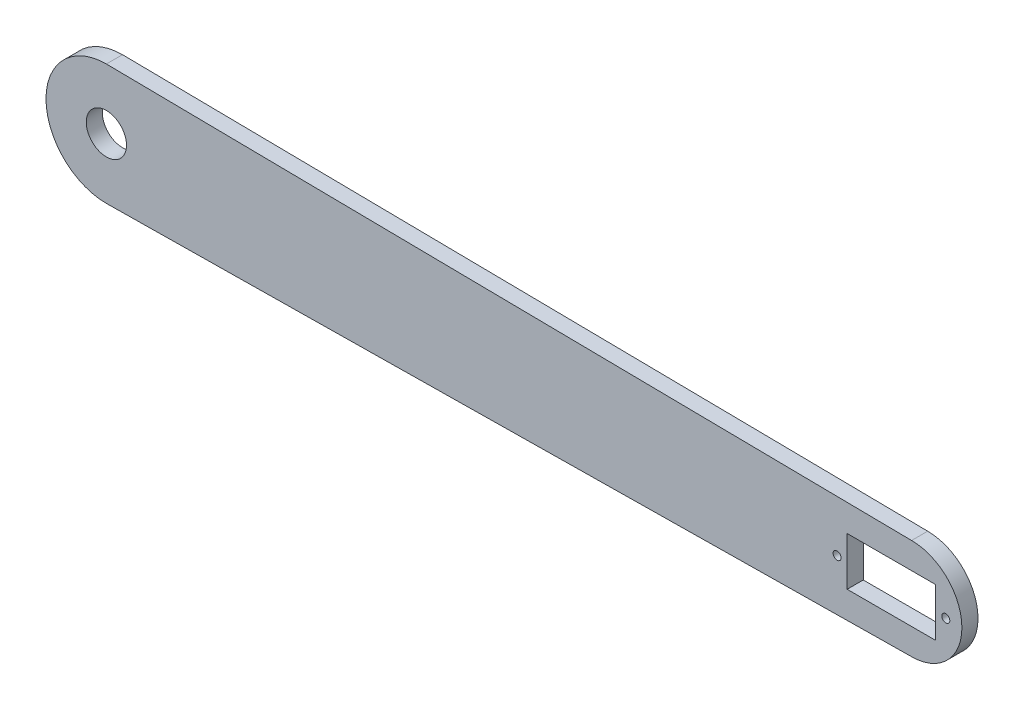
ISO-10303-21;
HEADER;
FILE_DESCRIPTION(('STEP AP214'),'2;1');
FILE_NAME('part.step','',(''),(''),'','','');
FILE_SCHEMA(('AUTOMOTIVE_DESIGN { 1 0 10303 214 1 1 1 1 }'));
ENDSEC;
DATA;
#1=APPLICATION_CONTEXT('core data for automotive mechanical design processes');
#2=APPLICATION_PROTOCOL_DEFINITION('international standard','automotive_design',2000,#1);
#3=PRODUCT_CONTEXT('',#1,'mechanical');
#4=PRODUCT('Part','Part','',(#3));
#5=PRODUCT_RELATED_PRODUCT_CATEGORY('part','',(#4));
#6=PRODUCT_DEFINITION_FORMATION('','',#4);
#7=PRODUCT_DEFINITION_CONTEXT('part definition',#1,'design');
#8=PRODUCT_DEFINITION('design','',#6,#7);
#9=PRODUCT_DEFINITION_SHAPE('','',#8);
#10=(LENGTH_UNIT() NAMED_UNIT(*) SI_UNIT(.MILLI.,.METRE.));
#11=(NAMED_UNIT(*) PLANE_ANGLE_UNIT() SI_UNIT($,.RADIAN.));
#12=(NAMED_UNIT(*) SI_UNIT($,.STERADIAN.) SOLID_ANGLE_UNIT());
#13=UNCERTAINTY_MEASURE_WITH_UNIT(LENGTH_MEASURE(1.E-05),#10,'distance_accuracy_value','');
#14=(GEOMETRIC_REPRESENTATION_CONTEXT(3) GLOBAL_UNCERTAINTY_ASSIGNED_CONTEXT((#13)) GLOBAL_UNIT_ASSIGNED_CONTEXT((#10,
#11,#12)) REPRESENTATION_CONTEXT('',''));
#15=CARTESIAN_POINT('',(0.,0.,0.));
#16=DIRECTION('',(0.,0.,1.));
#17=DIRECTION('',(1.,0.,0.));
#18=AXIS2_PLACEMENT_3D('',#15,#16,#17);
#19=CARTESIAN_POINT('',(200.,0.,4.));
#20=DIRECTION('',(0.,0.,-1.));
#21=DIRECTION('',(-1.,0.,0.));
#22=AXIS2_PLACEMENT_3D('',#19,#20,#21);
#23=CYLINDRICAL_SURFACE('',#22,12.5);
#24=CARTESIAN_POINT('',(200.,0.,0.));
#25=DIRECTION('',(0.,0.,1.));
#26=DIRECTION('',(1.,0.,0.));
#27=AXIS2_PLACEMENT_3D('',#24,#25,#26);
#28=CIRCLE('',#27,12.5);
#29=CARTESIAN_POINT('',(200.,12.5,0.));
#30=VERTEX_POINT('',#29);
#31=CARTESIAN_POINT('',(200.,-12.5,0.));
#32=VERTEX_POINT('',#31);
#33=EDGE_CURVE('E176',#30,#32,#28,.F.);
#34=ORIENTED_EDGE('',*,*,#33,.F.);
#35=DIRECTION('',(0.,0.,-1.));
#36=VECTOR('',#35,1.);
#37=CARTESIAN_POINT('',(200.,12.5,4.));
#38=LINE('',#37,#36);
#39=CARTESIAN_POINT('',(200.,12.5,4.));
#40=VERTEX_POINT('',#39);
#41=EDGE_CURVE('E11',#40,#30,#38,.T.);
#42=ORIENTED_EDGE('',*,*,#41,.F.);
#43=CARTESIAN_POINT('',(200.,0.,4.));
#44=DIRECTION('',(0.,0.,1.));
#45=DIRECTION('',(1.,0.,0.));
#46=AXIS2_PLACEMENT_3D('',#43,#44,#45);
#47=CIRCLE('',#46,12.5);
#48=CARTESIAN_POINT('',(200.,-12.5,4.));
#49=VERTEX_POINT('',#48);
#50=EDGE_CURVE('E137',#40,#49,#47,.F.);
#51=ORIENTED_EDGE('',*,*,#50,.T.);
#52=DIRECTION('',(0.,0.,-1.));
#53=VECTOR('',#52,1.);
#54=CARTESIAN_POINT('',(200.,-12.5,4.));
#55=LINE('',#54,#53);
#56=EDGE_CURVE('E96',#49,#32,#55,.T.);
#57=ORIENTED_EDGE('',*,*,#56,.T.);
#58=EDGE_LOOP('',(#34,#42,#51,#57));
#59=FACE_BOUND('',#58,.T.);
#60=ADVANCED_FACE('F41',(#59),#23,.T.);
#61=CARTESIAN_POINT('',(0.187470707701921,14.9976566161537,4.));
#62=DIRECTION('',(0.012499023551926,0.999921884154082,0.));
#63=DIRECTION('',(-0.999921884154082,0.012499023551926,0.));
#64=AXIS2_PLACEMENT_3D('',#61,#62,#63);
#65=PLANE('',#64);
#66=DIRECTION('',(0.999921884154082,-0.012499023551926,0.));
#67=VECTOR('',#66,1.);
#68=CARTESIAN_POINT('',(0.187470707701921,14.9976566161537,0.));
#69=LINE('',#68,#67);
#70=CARTESIAN_POINT('',(0.,15.,0.));
#71=VERTEX_POINT('',#70);
#72=EDGE_CURVE('E124',#71,#30,#69,.T.);
#73=ORIENTED_EDGE('',*,*,#72,.F.);
#74=DIRECTION('',(0.,0.,-1.));
#75=VECTOR('',#74,1.);
#76=CARTESIAN_POINT('',(0.,15.,4.));
#77=LINE('',#76,#75);
#78=CARTESIAN_POINT('',(0.,15.,4.));
#79=VERTEX_POINT('',#78);
#80=EDGE_CURVE('E52',#79,#71,#77,.T.);
#81=ORIENTED_EDGE('',*,*,#80,.F.);
#82=DIRECTION('',(0.999921884154082,-0.012499023551926,0.));
#83=VECTOR('',#82,1.);
#84=CARTESIAN_POINT('',(0.187470707701921,14.9976566161537,4.));
#85=LINE('',#84,#83);
#86=EDGE_CURVE('E122',#79,#40,#85,.T.);
#87=ORIENTED_EDGE('',*,*,#86,.T.);
#88=ORIENTED_EDGE('',*,*,#41,.T.);
#89=EDGE_LOOP('',(#73,#81,#87,#88));
#90=FACE_BOUND('',#89,.T.);
#91=ADVANCED_FACE('F120',(#90),#65,.T.);
#92=CARTESIAN_POINT('',(0.,0.,4.));
#93=DIRECTION('',(0.,0.,-1.));
#94=DIRECTION('',(-1.,0.,0.));
#95=AXIS2_PLACEMENT_3D('',#92,#93,#94);
#96=CYLINDRICAL_SURFACE('',#95,15.);
#97=CARTESIAN_POINT('',(0.,0.,0.));
#98=DIRECTION('',(0.,0.,1.));
#99=DIRECTION('',(1.,0.,0.));
#100=AXIS2_PLACEMENT_3D('',#97,#98,#99);
#101=CIRCLE('',#100,15.);
#102=CARTESIAN_POINT('',(0.,-15.,0.));
#103=VERTEX_POINT('',#102);
#104=EDGE_CURVE('E181',#71,#103,#101,.T.);
#105=ORIENTED_EDGE('',*,*,#104,.T.);
#106=DIRECTION('',(0.,0.,-1.));
#107=VECTOR('',#106,1.);
#108=CARTESIAN_POINT('',(0.,-15.,4.));
#109=LINE('',#108,#107);
#110=CARTESIAN_POINT('',(0.,-15.,4.));
#111=VERTEX_POINT('',#110);
#112=EDGE_CURVE('E128',#111,#103,#109,.T.);
#113=ORIENTED_EDGE('',*,*,#112,.F.);
#114=CARTESIAN_POINT('',(0.,0.,4.));
#115=DIRECTION('',(0.,0.,1.));
#116=DIRECTION('',(1.,0.,0.));
#117=AXIS2_PLACEMENT_3D('',#114,#115,#116);
#118=CIRCLE('',#117,15.);
#119=EDGE_CURVE('E131',#79,#111,#118,.T.);
#120=ORIENTED_EDGE('',*,*,#119,.F.);
#121=ORIENTED_EDGE('',*,*,#80,.T.);
#122=EDGE_LOOP('',(#105,#113,#120,#121));
#123=FACE_BOUND('',#122,.T.);
#124=ADVANCED_FACE('F132',(#123),#96,.T.);
#125=CARTESIAN_POINT('',(0.,-5.99999999999996,4.));
#126=DIRECTION('',(0.,1.,0.));
#127=DIRECTION('',(-1.,0.,0.));
#128=AXIS2_PLACEMENT_3D('',#125,#126,#127);
#129=PLANE('',#128);
#130=DIRECTION('',(1.,0.,0.));
#131=VECTOR('',#130,1.);
#132=CARTESIAN_POINT('',(0.,-5.99999999999996,0.));
#133=LINE('',#132,#131);
#134=CARTESIAN_POINT('',(184.,-5.99999999999994,0.));
#135=VERTEX_POINT('',#134);
#136=CARTESIAN_POINT('',(206.,-5.99999999999994,0.));
#137=VERTEX_POINT('',#136);
#138=EDGE_CURVE('E156',#135,#137,#133,.T.);
#139=ORIENTED_EDGE('',*,*,#138,.F.);
#140=DIRECTION('',(0.,0.,-1.));
#141=VECTOR('',#140,1.);
#142=CARTESIAN_POINT('',(184.,-5.99999999999994,4.));
#143=LINE('',#142,#141);
#144=CARTESIAN_POINT('',(184.,-5.99999999999994,4.));
#145=VERTEX_POINT('',#144);
#146=EDGE_CURVE('E45',#145,#135,#143,.T.);
#147=ORIENTED_EDGE('',*,*,#146,.F.);
#148=DIRECTION('',(1.,0.,0.));
#149=VECTOR('',#148,1.);
#150=CARTESIAN_POINT('',(0.,-5.99999999999996,4.));
#151=LINE('',#150,#149);
#152=CARTESIAN_POINT('',(206.,-5.99999999999994,4.));
#153=VERTEX_POINT('',#152);
#154=EDGE_CURVE('E231',#145,#153,#151,.T.);
#155=ORIENTED_EDGE('',*,*,#154,.T.);
#156=DIRECTION('',(0.,0.,-1.));
#157=VECTOR('',#156,1.);
#158=CARTESIAN_POINT('',(206.,-5.99999999999994,4.));
#159=LINE('',#158,#157);
#160=EDGE_CURVE('E151',#153,#137,#159,.T.);
#161=ORIENTED_EDGE('',*,*,#160,.T.);
#162=EDGE_LOOP('',(#139,#147,#155,#161));
#163=FACE_BOUND('',#162,.T.);
#164=ADVANCED_FACE('F212',(#163),#129,.T.);
#165=CARTESIAN_POINT('',(184.,0.,4.));
#166=DIRECTION('',(1.,0.,0.));
#167=DIRECTION('',(0.,0.,-1.));
#168=AXIS2_PLACEMENT_3D('',#165,#166,#167);
#169=PLANE('',#168);
#170=DIRECTION('',(0.,-1.,0.));
#171=VECTOR('',#170,1.);
#172=CARTESIAN_POINT('',(184.,0.,0.));
#173=LINE('',#172,#171);
#174=CARTESIAN_POINT('',(184.,6.00000000000006,0.));
#175=VERTEX_POINT('',#174);
#176=EDGE_CURVE('E160',#175,#135,#173,.T.);
#177=ORIENTED_EDGE('',*,*,#176,.F.);
#178=DIRECTION('',(0.,0.,-1.));
#179=VECTOR('',#178,1.);
#180=CARTESIAN_POINT('',(184.,6.00000000000006,4.));
#181=LINE('',#180,#179);
#182=CARTESIAN_POINT('',(184.,6.00000000000006,4.));
#183=VERTEX_POINT('',#182);
#184=EDGE_CURVE('E200',#183,#175,#181,.T.);
#185=ORIENTED_EDGE('',*,*,#184,.F.);
#186=DIRECTION('',(0.,-1.,0.));
#187=VECTOR('',#186,1.);
#188=CARTESIAN_POINT('',(184.,0.,4.));
#189=LINE('',#188,#187);
#190=EDGE_CURVE('E211',#183,#145,#189,.T.);
#191=ORIENTED_EDGE('',*,*,#190,.T.);
#192=ORIENTED_EDGE('',*,*,#146,.T.);
#193=EDGE_LOOP('',(#177,#185,#191,#192));
#194=FACE_BOUND('',#193,.T.);
#195=ADVANCED_FACE('F209',(#194),#169,.T.);
#196=CARTESIAN_POINT('',(0.,6.00000000000003,4.));
#197=DIRECTION('',(0.,1.,0.));
#198=DIRECTION('',(-1.,0.,0.));
#199=AXIS2_PLACEMENT_3D('',#196,#197,#198);
#200=PLANE('',#199);
#201=DIRECTION('',(1.,0.,0.));
#202=VECTOR('',#201,1.);
#203=CARTESIAN_POINT('',(0.,6.00000000000003,0.));
#204=LINE('',#203,#202);
#205=CARTESIAN_POINT('',(206.,6.00000000000007,0.));
#206=VERTEX_POINT('',#205);
#207=EDGE_CURVE('E164',#175,#206,#204,.T.);
#208=ORIENTED_EDGE('',*,*,#207,.T.);
#209=DIRECTION('',(0.,0.,-1.));
#210=VECTOR('',#209,1.);
#211=CARTESIAN_POINT('',(206.,6.00000000000007,4.));
#212=LINE('',#211,#210);
#213=CARTESIAN_POINT('',(206.,6.00000000000007,4.));
#214=VERTEX_POINT('',#213);
#215=EDGE_CURVE('E197',#214,#206,#212,.T.);
#216=ORIENTED_EDGE('',*,*,#215,.F.);
#217=DIRECTION('',(1.,0.,0.));
#218=VECTOR('',#217,1.);
#219=CARTESIAN_POINT('',(0.,6.00000000000003,4.));
#220=LINE('',#219,#218);
#221=EDGE_CURVE('E220',#183,#214,#220,.T.);
#222=ORIENTED_EDGE('',*,*,#221,.F.);
#223=ORIENTED_EDGE('',*,*,#184,.T.);
#224=EDGE_LOOP('',(#208,#216,#222,#223));
#225=FACE_BOUND('',#224,.T.);
#226=ADVANCED_FACE('F218',(#225),#200,.F.);
#227=CARTESIAN_POINT('',(0.187470707701921,-14.9976566161537,4.));
#228=DIRECTION('',(-0.012499023551926,0.999921884154082,0.));
#229=DIRECTION('',(-0.999921884154082,-0.012499023551926,0.));
#230=AXIS2_PLACEMENT_3D('',#227,#228,#229);
#231=PLANE('',#230);
#232=DIRECTION('',(0.999921884154082,0.012499023551926,0.));
#233=VECTOR('',#232,1.);
#234=CARTESIAN_POINT('',(0.187470707701921,-14.9976566161537,0.));
#235=LINE('',#234,#233);
#236=EDGE_CURVE('E89',#103,#32,#235,.T.);
#237=ORIENTED_EDGE('',*,*,#236,.T.);
#238=ORIENTED_EDGE('',*,*,#56,.F.);
#239=DIRECTION('',(0.999921884154082,0.012499023551926,0.));
#240=VECTOR('',#239,1.);
#241=CARTESIAN_POINT('',(0.187470707701921,-14.9976566161537,4.));
#242=LINE('',#241,#240);
#243=EDGE_CURVE('E61',#111,#49,#242,.T.);
#244=ORIENTED_EDGE('',*,*,#243,.F.);
#245=ORIENTED_EDGE('',*,*,#112,.T.);
#246=EDGE_LOOP('',(#237,#238,#244,#245));
#247=FACE_BOUND('',#246,.T.);
#248=ADVANCED_FACE('F263',(#247),#231,.F.);
#249=CARTESIAN_POINT('',(208.5,0.,4.));
#250=DIRECTION('',(0.,0.,-1.));
#251=DIRECTION('',(-1.,0.,0.));
#252=AXIS2_PLACEMENT_3D('',#249,#250,#251);
#253=CYLINDRICAL_SURFACE('',#252,0.999999999999998);
#254=CARTESIAN_POINT('',(208.5,0.,4.));
#255=DIRECTION('',(0.,0.,1.));
#256=DIRECTION('',(1.,0.,0.));
#257=AXIS2_PLACEMENT_3D('',#254,#255,#256);
#258=CIRCLE('',#257,0.999999999999998);
#259=CARTESIAN_POINT('',(209.5,0.,4.));
#260=VERTEX_POINT('',#259);
#261=EDGE_CURVE('E141',#260,#260,#258,.T.);
#262=ORIENTED_EDGE('',*,*,#261,.T.);
#263=EDGE_LOOP('',(#262));
#264=FACE_BOUND('',#263,.T.);
#265=CARTESIAN_POINT('',(208.5,0.,0.));
#266=DIRECTION('',(0.,0.,1.));
#267=DIRECTION('',(1.,0.,0.));
#268=AXIS2_PLACEMENT_3D('',#265,#266,#267);
#269=CIRCLE('',#268,0.999999999999998);
#270=CARTESIAN_POINT('',(209.5,0.,0.));
#271=VERTEX_POINT('',#270);
#272=EDGE_CURVE('E172',#271,#271,#269,.T.);
#273=ORIENTED_EDGE('',*,*,#272,.F.);
#274=EDGE_LOOP('',(#273));
#275=FACE_BOUND('',#274,.T.);
#276=ADVANCED_FACE('F238',(#264,#275),#253,.F.);
#277=CARTESIAN_POINT('',(206.,4.76470714734963E-13,4.));
#278=DIRECTION('',(1.,0.,0.));
#279=DIRECTION('',(0.,1.,0.));
#280=AXIS2_PLACEMENT_3D('',#277,#278,#279);
#281=PLANE('',#280);
#282=DIRECTION('',(0.,-1.,0.));
#283=VECTOR('',#282,1.);
#284=CARTESIAN_POINT('',(206.,4.76470714734963E-13,0.));
#285=LINE('',#284,#283);
#286=EDGE_CURVE('E168',#206,#137,#285,.T.);
#287=ORIENTED_EDGE('',*,*,#286,.T.);
#288=ORIENTED_EDGE('',*,*,#160,.F.);
#289=DIRECTION('',(0.,-1.,0.));
#290=VECTOR('',#289,1.);
#291=CARTESIAN_POINT('',(206.,4.76470714734963E-13,4.));
#292=LINE('',#291,#290);
#293=EDGE_CURVE('E223',#214,#153,#292,.T.);
#294=ORIENTED_EDGE('',*,*,#293,.F.);
#295=ORIENTED_EDGE('',*,*,#215,.T.);
#296=EDGE_LOOP('',(#287,#288,#294,#295));
#297=FACE_BOUND('',#296,.T.);
#298=ADVANCED_FACE('F222',(#297),#281,.F.);
#299=CARTESIAN_POINT('',(181.5,0.,4.));
#300=DIRECTION('',(0.,0.,-1.));
#301=DIRECTION('',(-1.,0.,0.));
#302=AXIS2_PLACEMENT_3D('',#299,#300,#301);
#303=CYLINDRICAL_SURFACE('',#302,0.999999999999998);
#304=CARTESIAN_POINT('',(181.5,0.,4.));
#305=DIRECTION('',(0.,0.,1.));
#306=DIRECTION('',(1.,0.,0.));
#307=AXIS2_PLACEMENT_3D('',#304,#305,#306);
#308=CIRCLE('',#307,0.999999999999998);
#309=CARTESIAN_POINT('',(182.5,0.,4.));
#310=VERTEX_POINT('',#309);
#311=EDGE_CURVE('E190',#310,#310,#308,.T.);
#312=ORIENTED_EDGE('',*,*,#311,.T.);
#313=EDGE_LOOP('',(#312));
#314=FACE_BOUND('',#313,.T.);
#315=CARTESIAN_POINT('',(181.5,0.,0.));
#316=DIRECTION('',(0.,0.,1.));
#317=DIRECTION('',(1.,0.,0.));
#318=AXIS2_PLACEMENT_3D('',#315,#316,#317);
#319=CIRCLE('',#318,0.999999999999998);
#320=CARTESIAN_POINT('',(182.5,0.,0.));
#321=VERTEX_POINT('',#320);
#322=EDGE_CURVE('E152',#321,#321,#319,.T.);
#323=ORIENTED_EDGE('',*,*,#322,.F.);
#324=EDGE_LOOP('',(#323));
#325=FACE_BOUND('',#324,.T.);
#326=ADVANCED_FACE('F43',(#314,#325),#303,.F.);
#327=CARTESIAN_POINT('',(0.,0.,4.));
#328=DIRECTION('',(0.,0.,-1.));
#329=DIRECTION('',(-1.,0.,0.));
#330=AXIS2_PLACEMENT_3D('',#327,#328,#329);
#331=CYLINDRICAL_SURFACE('',#330,5.);
#332=CARTESIAN_POINT('',(0.,0.,4.));
#333=DIRECTION('',(0.,0.,1.));
#334=DIRECTION('',(1.,0.,0.));
#335=AXIS2_PLACEMENT_3D('',#332,#333,#334);
#336=CIRCLE('',#335,5.);
#337=CARTESIAN_POINT('',(5.,0.,4.));
#338=VERTEX_POINT('',#337);
#339=EDGE_CURVE('E147',#338,#338,#336,.T.);
#340=ORIENTED_EDGE('',*,*,#339,.T.);
#341=EDGE_LOOP('',(#340));
#342=FACE_BOUND('',#341,.T.);
#343=CARTESIAN_POINT('',(0.,0.,0.));
#344=DIRECTION('',(0.,0.,1.));
#345=DIRECTION('',(1.,0.,0.));
#346=AXIS2_PLACEMENT_3D('',#343,#344,#345);
#347=CIRCLE('',#346,5.);
#348=CARTESIAN_POINT('',(5.,0.,0.));
#349=VERTEX_POINT('',#348);
#350=EDGE_CURVE('E186',#349,#349,#347,.T.);
#351=ORIENTED_EDGE('',*,*,#350,.F.);
#352=EDGE_LOOP('',(#351));
#353=FACE_BOUND('',#352,.T.);
#354=ADVANCED_FACE('F241',(#342,#353),#331,.F.);
#355=CARTESIAN_POINT('',(0.,0.,4.));
#356=DIRECTION('',(0.,0.,1.));
#357=DIRECTION('',(1.,0.,0.));
#358=AXIS2_PLACEMENT_3D('',#355,#356,#357);
#359=PLANE('',#358);
#360=ORIENTED_EDGE('',*,*,#311,.F.);
#361=EDGE_LOOP('',(#360));
#362=FACE_BOUND('',#361,.T.);
#363=ORIENTED_EDGE('',*,*,#154,.F.);
#364=ORIENTED_EDGE('',*,*,#190,.F.);
#365=ORIENTED_EDGE('',*,*,#221,.T.);
#366=ORIENTED_EDGE('',*,*,#293,.T.);
#367=EDGE_LOOP('',(#363,#364,#365,#366));
#368=FACE_BOUND('',#367,.T.);
#369=ORIENTED_EDGE('',*,*,#261,.F.);
#370=EDGE_LOOP('',(#369));
#371=FACE_BOUND('',#370,.T.);
#372=ORIENTED_EDGE('',*,*,#50,.F.);
#373=ORIENTED_EDGE('',*,*,#86,.F.);
#374=ORIENTED_EDGE('',*,*,#119,.T.);
#375=ORIENTED_EDGE('',*,*,#243,.T.);
#376=EDGE_LOOP('',(#372,#373,#374,#375));
#377=FACE_BOUND('',#376,.T.);
#378=ORIENTED_EDGE('',*,*,#339,.F.);
#379=EDGE_LOOP('',(#378));
#380=FACE_BOUND('',#379,.T.);
#381=ADVANCED_FACE('F135',(#362,#368,#371,#377,#380),#359,.T.);
#382=CARTESIAN_POINT('',(0.,0.,0.));
#383=DIRECTION('',(0.,0.,1.));
#384=DIRECTION('',(1.,0.,0.));
#385=AXIS2_PLACEMENT_3D('',#382,#383,#384);
#386=PLANE('',#385);
#387=ORIENTED_EDGE('',*,*,#322,.T.);
#388=EDGE_LOOP('',(#387));
#389=FACE_BOUND('',#388,.T.);
#390=ORIENTED_EDGE('',*,*,#138,.T.);
#391=ORIENTED_EDGE('',*,*,#286,.F.);
#392=ORIENTED_EDGE('',*,*,#207,.F.);
#393=ORIENTED_EDGE('',*,*,#176,.T.);
#394=EDGE_LOOP('',(#390,#391,#392,#393));
#395=FACE_BOUND('',#394,.T.);
#396=ORIENTED_EDGE('',*,*,#272,.T.);
#397=EDGE_LOOP('',(#396));
#398=FACE_BOUND('',#397,.T.);
#399=ORIENTED_EDGE('',*,*,#33,.T.);
#400=ORIENTED_EDGE('',*,*,#236,.F.);
#401=ORIENTED_EDGE('',*,*,#104,.F.);
#402=ORIENTED_EDGE('',*,*,#72,.T.);
#403=EDGE_LOOP('',(#399,#400,#401,#402));
#404=FACE_BOUND('',#403,.T.);
#405=ORIENTED_EDGE('',*,*,#350,.T.);
#406=EDGE_LOOP('',(#405));
#407=FACE_BOUND('',#406,.T.);
#408=ADVANCED_FACE('F215',(#389,#395,#398,#404,#407),#386,.F.);
#409=CLOSED_SHELL('',(#60,#91,#124,#164,#195,#226,#248,#276,#298,#326,#354,#381,#408));
#410=MANIFOLD_SOLID_BREP('B2',#409);
#411=ADVANCED_BREP_SHAPE_REPRESENTATION('',(#18,#410),#14);
#412=SHAPE_DEFINITION_REPRESENTATION(#9,#411);
ENDSEC;
END-ISO-10303-21;
